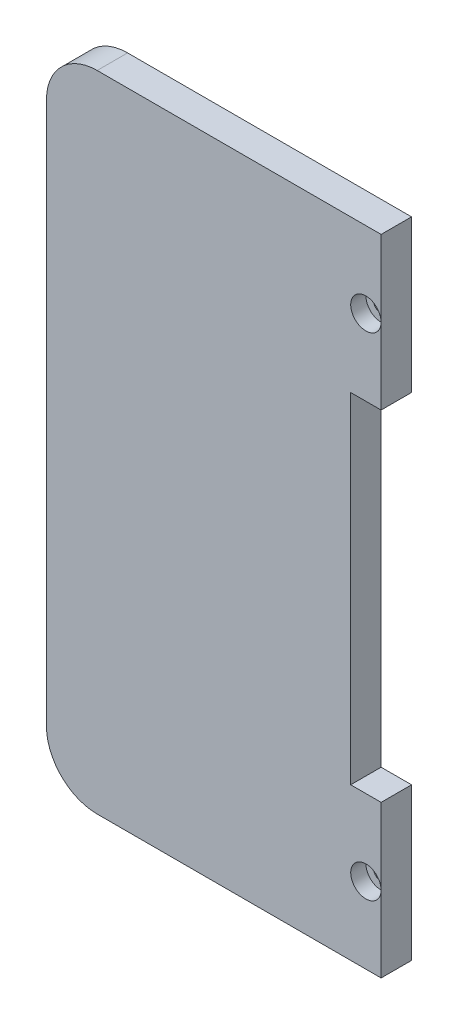
ISO-10303-21;
HEADER;
FILE_DESCRIPTION(('STEP AP214'),'2;1');
FILE_NAME('part.step','',(''),(''),'','','');
FILE_SCHEMA(('AUTOMOTIVE_DESIGN { 1 0 10303 214 1 1 1 1 }'));
ENDSEC;
DATA;
#1=APPLICATION_CONTEXT('core data for automotive mechanical design processes');
#2=APPLICATION_PROTOCOL_DEFINITION('international standard','automotive_design',2000,#1);
#3=PRODUCT_CONTEXT('',#1,'mechanical');
#4=PRODUCT('Part','Part','',(#3));
#5=PRODUCT_RELATED_PRODUCT_CATEGORY('part','',(#4));
#6=PRODUCT_DEFINITION_FORMATION('','',#4);
#7=PRODUCT_DEFINITION_CONTEXT('part definition',#1,'design');
#8=PRODUCT_DEFINITION('design','',#6,#7);
#9=PRODUCT_DEFINITION_SHAPE('','',#8);
#10=(LENGTH_UNIT() NAMED_UNIT(*) SI_UNIT(.MILLI.,.METRE.));
#11=(NAMED_UNIT(*) PLANE_ANGLE_UNIT() SI_UNIT($,.RADIAN.));
#12=(NAMED_UNIT(*) SI_UNIT($,.STERADIAN.) SOLID_ANGLE_UNIT());
#13=UNCERTAINTY_MEASURE_WITH_UNIT(LENGTH_MEASURE(1.E-05),#10,'distance_accuracy_value','');
#14=(GEOMETRIC_REPRESENTATION_CONTEXT(3) GLOBAL_UNCERTAINTY_ASSIGNED_CONTEXT((#13)) GLOBAL_UNIT_ASSIGNED_CONTEXT((#10,
#11,#12)) REPRESENTATION_CONTEXT('',''));
#15=CARTESIAN_POINT('',(0.,0.,0.));
#16=DIRECTION('',(0.,0.,1.));
#17=DIRECTION('',(1.,0.,0.));
#18=AXIS2_PLACEMENT_3D('',#15,#16,#17);
#19=CARTESIAN_POINT('',(30.,-48.5,6.));
#20=DIRECTION('',(0.,0.,-1.));
#21=DIRECTION('',(-1.,0.,0.));
#22=AXIS2_PLACEMENT_3D('',#19,#20,#21);
#23=CYLINDRICAL_SURFACE('',#22,1.5);
#24=CARTESIAN_POINT('',(30.,-48.5,0.));
#25=DIRECTION('',(0.,0.,-1.));
#26=DIRECTION('',(-1.,0.,0.));
#27=AXIS2_PLACEMENT_3D('',#24,#25,#26);
#28=CIRCLE('',#27,1.5);
#29=CARTESIAN_POINT('',(28.5,-48.5,0.));
#30=VERTEX_POINT('',#29);
#31=EDGE_CURVE('E179',#30,#30,#28,.T.);
#32=ORIENTED_EDGE('',*,*,#31,.T.);
#33=EDGE_LOOP('',(#32));
#34=FACE_BOUND('',#33,.T.);
#35=CARTESIAN_POINT('',(30.,-48.5,3.));
#36=DIRECTION('',(0.,0.,1.));
#37=DIRECTION('',(1.,0.,0.));
#38=AXIS2_PLACEMENT_3D('',#35,#36,#37);
#39=CIRCLE('',#38,1.5);
#40=CARTESIAN_POINT('',(31.5,-48.5,3.));
#41=VERTEX_POINT('',#40);
#42=EDGE_CURVE('E37',#41,#41,#39,.F.);
#43=ORIENTED_EDGE('',*,*,#42,.F.);
#44=EDGE_LOOP('',(#43));
#45=FACE_BOUND('',#44,.T.);
#46=ADVANCED_FACE('F33',(#34,#45),#23,.F.);
#47=CARTESIAN_POINT('',(30.,48.5,6.));
#48=DIRECTION('',(0.,0.,-1.));
#49=DIRECTION('',(-1.,0.,0.));
#50=AXIS2_PLACEMENT_3D('',#47,#48,#49);
#51=CYLINDRICAL_SURFACE('',#50,1.5);
#52=CARTESIAN_POINT('',(30.,48.5,0.));
#53=DIRECTION('',(0.,0.,-1.));
#54=DIRECTION('',(1.,0.,0.));
#55=AXIS2_PLACEMENT_3D('',#52,#53,#54);
#56=CIRCLE('',#55,1.5);
#57=CARTESIAN_POINT('',(31.5,48.5,0.));
#58=VERTEX_POINT('',#57);
#59=EDGE_CURVE('E174',#58,#58,#56,.T.);
#60=ORIENTED_EDGE('',*,*,#59,.T.);
#61=EDGE_LOOP('',(#60));
#62=FACE_BOUND('',#61,.T.);
#63=CARTESIAN_POINT('',(30.,48.5,3.));
#64=DIRECTION('',(0.,0.,1.));
#65=DIRECTION('',(1.,0.,0.));
#66=AXIS2_PLACEMENT_3D('',#63,#64,#65);
#67=CIRCLE('',#66,1.5);
#68=CARTESIAN_POINT('',(31.5,48.5,3.));
#69=VERTEX_POINT('',#68);
#70=EDGE_CURVE('E172',#69,#69,#67,.F.);
#71=ORIENTED_EDGE('',*,*,#70,.F.);
#72=EDGE_LOOP('',(#71));
#73=FACE_BOUND('',#72,.T.);
#74=ADVANCED_FACE('F250',(#62,#73),#51,.F.);
#75=CARTESIAN_POINT('',(33.,63.5,6.));
#76=DIRECTION('',(-1.,0.,0.));
#77=DIRECTION('',(0.,-1.,0.));
#78=AXIS2_PLACEMENT_3D('',#75,#76,#77);
#79=PLANE('',#78);
#80=DIRECTION('',(0.,1.,0.));
#81=VECTOR('',#80,1.);
#82=CARTESIAN_POINT('',(33.,63.5,6.));
#83=LINE('',#82,#81);
#84=CARTESIAN_POINT('',(33.,33.5,6.));
#85=VERTEX_POINT('',#84);
#86=CARTESIAN_POINT('',(33.,63.5,6.));
#87=VERTEX_POINT('',#86);
#88=EDGE_CURVE('E136',#85,#87,#83,.T.);
#89=ORIENTED_EDGE('',*,*,#88,.F.);
#90=DIRECTION('',(0.,0.,-1.));
#91=VECTOR('',#90,1.);
#92=CARTESIAN_POINT('',(33.,33.5,6.));
#93=LINE('',#92,#91);
#94=CARTESIAN_POINT('',(33.,33.5,0.));
#95=VERTEX_POINT('',#94);
#96=EDGE_CURVE('E202',#85,#95,#93,.T.);
#97=ORIENTED_EDGE('',*,*,#96,.T.);
#98=DIRECTION('',(0.,1.,0.));
#99=VECTOR('',#98,1.);
#100=CARTESIAN_POINT('',(33.,63.5,0.));
#101=LINE('',#100,#99);
#102=CARTESIAN_POINT('',(33.,63.5,0.));
#103=VERTEX_POINT('',#102);
#104=EDGE_CURVE('E149',#95,#103,#101,.T.);
#105=ORIENTED_EDGE('',*,*,#104,.T.);
#106=DIRECTION('',(0.,0.,-1.));
#107=VECTOR('',#106,1.);
#108=CARTESIAN_POINT('',(33.,63.5,6.));
#109=LINE('',#108,#107);
#110=EDGE_CURVE('E157',#87,#103,#109,.T.);
#111=ORIENTED_EDGE('',*,*,#110,.F.);
#112=EDGE_LOOP('',(#89,#97,#105,#111));
#113=FACE_BOUND('',#112,.T.);
#114=ADVANCED_FACE('F219',(#113),#79,.F.);
#115=CARTESIAN_POINT('',(33.,-63.5,0.));
#116=VERTEX_POINT('',#115);
#117=CARTESIAN_POINT('',(33.,-33.5,0.));
#118=VERTEX_POINT('',#117);
#119=EDGE_CURVE('E128',#116,#118,#101,.T.);
#120=ORIENTED_EDGE('',*,*,#119,.T.);
#121=DIRECTION('',(0.,0.,-1.));
#122=VECTOR('',#121,1.);
#123=CARTESIAN_POINT('',(33.,-33.5,6.));
#124=LINE('',#123,#122);
#125=CARTESIAN_POINT('',(33.,-33.5,6.));
#126=VERTEX_POINT('',#125);
#127=EDGE_CURVE('E50',#126,#118,#124,.T.);
#128=ORIENTED_EDGE('',*,*,#127,.F.);
#129=CARTESIAN_POINT('',(33.,-63.5,6.));
#130=VERTEX_POINT('',#129);
#131=EDGE_CURVE('E126',#130,#126,#83,.T.);
#132=ORIENTED_EDGE('',*,*,#131,.F.);
#133=DIRECTION('',(0.,0.,-1.));
#134=VECTOR('',#133,1.);
#135=CARTESIAN_POINT('',(33.,-63.5,6.));
#136=LINE('',#135,#134);
#137=EDGE_CURVE('E146',#130,#116,#136,.T.);
#138=ORIENTED_EDGE('',*,*,#137,.T.);
#139=EDGE_LOOP('',(#120,#128,#132,#138));
#140=FACE_BOUND('',#139,.T.);
#141=ADVANCED_FACE('F124',(#140),#79,.F.);
#142=CARTESIAN_POINT('',(-33.,63.5,6.));
#143=DIRECTION('',(0.,-1.,0.));
#144=DIRECTION('',(0.,0.,-1.));
#145=AXIS2_PLACEMENT_3D('',#142,#143,#144);
#146=PLANE('',#145);
#147=DIRECTION('',(-1.,0.,0.));
#148=VECTOR('',#147,1.);
#149=CARTESIAN_POINT('',(-33.,63.5,0.));
#150=LINE('',#149,#148);
#151=CARTESIAN_POINT('',(-23.,63.5,0.));
#152=VERTEX_POINT('',#151);
#153=EDGE_CURVE('E148',#103,#152,#150,.T.);
#154=ORIENTED_EDGE('',*,*,#153,.T.);
#155=DIRECTION('',(0.,0.,-1.));
#156=VECTOR('',#155,1.);
#157=CARTESIAN_POINT('',(-23.,63.5,6.));
#158=LINE('',#157,#156);
#159=CARTESIAN_POINT('',(-23.,63.5,6.));
#160=VERTEX_POINT('',#159);
#161=EDGE_CURVE('E169',#152,#160,#158,.F.);
#162=ORIENTED_EDGE('',*,*,#161,.T.);
#163=DIRECTION('',(-1.,0.,0.));
#164=VECTOR('',#163,1.);
#165=CARTESIAN_POINT('',(-33.,63.5,6.));
#166=LINE('',#165,#164);
#167=EDGE_CURVE('E135',#87,#160,#166,.T.);
#168=ORIENTED_EDGE('',*,*,#167,.F.);
#169=ORIENTED_EDGE('',*,*,#110,.T.);
#170=EDGE_LOOP('',(#154,#162,#168,#169));
#171=FACE_BOUND('',#170,.T.);
#172=ADVANCED_FACE('F224',(#171),#146,.F.);
#173=CARTESIAN_POINT('',(-33.,63.5,6.));
#174=DIRECTION('',(1.,0.,0.));
#175=DIRECTION('',(0.,1.,0.));
#176=AXIS2_PLACEMENT_3D('',#173,#174,#175);
#177=PLANE('',#176);
#178=DIRECTION('',(0.,-1.,0.));
#179=VECTOR('',#178,1.);
#180=CARTESIAN_POINT('',(-33.,63.5,6.));
#181=LINE('',#180,#179);
#182=CARTESIAN_POINT('',(-33.,53.5,6.));
#183=VERTEX_POINT('',#182);
#184=CARTESIAN_POINT('',(-33.,-53.5,6.));
#185=VERTEX_POINT('',#184);
#186=EDGE_CURVE('E139',#183,#185,#181,.T.);
#187=ORIENTED_EDGE('',*,*,#186,.F.);
#188=DIRECTION('',(0.,0.,-1.));
#189=VECTOR('',#188,1.);
#190=CARTESIAN_POINT('',(-33.,53.5,6.));
#191=LINE('',#190,#189);
#192=CARTESIAN_POINT('',(-33.,53.5,0.));
#193=VERTEX_POINT('',#192);
#194=EDGE_CURVE('E162',#183,#193,#191,.T.);
#195=ORIENTED_EDGE('',*,*,#194,.T.);
#196=DIRECTION('',(0.,-1.,0.));
#197=VECTOR('',#196,1.);
#198=CARTESIAN_POINT('',(-33.,63.5,0.));
#199=LINE('',#198,#197);
#200=CARTESIAN_POINT('',(-33.,-53.5,0.));
#201=VERTEX_POINT('',#200);
#202=EDGE_CURVE('E152',#193,#201,#199,.T.);
#203=ORIENTED_EDGE('',*,*,#202,.T.);
#204=DIRECTION('',(0.,0.,-1.));
#205=VECTOR('',#204,1.);
#206=CARTESIAN_POINT('',(-33.,-53.5,6.));
#207=LINE('',#206,#205);
#208=EDGE_CURVE('E160',#201,#185,#207,.F.);
#209=ORIENTED_EDGE('',*,*,#208,.T.);
#210=EDGE_LOOP('',(#187,#195,#203,#209));
#211=FACE_BOUND('',#210,.T.);
#212=ADVANCED_FACE('F231',(#211),#177,.F.);
#213=CARTESIAN_POINT('',(-33.,-63.5,6.));
#214=DIRECTION('',(0.,1.,0.));
#215=DIRECTION('',(0.,0.,1.));
#216=AXIS2_PLACEMENT_3D('',#213,#214,#215);
#217=PLANE('',#216);
#218=DIRECTION('',(1.,0.,0.));
#219=VECTOR('',#218,1.);
#220=CARTESIAN_POINT('',(-33.,-63.5,6.));
#221=LINE('',#220,#219);
#222=CARTESIAN_POINT('',(-23.,-63.5,6.));
#223=VERTEX_POINT('',#222);
#224=EDGE_CURVE('E133',#223,#130,#221,.T.);
#225=ORIENTED_EDGE('',*,*,#224,.F.);
#226=DIRECTION('',(0.,0.,-1.));
#227=VECTOR('',#226,1.);
#228=CARTESIAN_POINT('',(-23.,-63.5,6.));
#229=LINE('',#228,#227);
#230=CARTESIAN_POINT('',(-23.,-63.5,0.));
#231=VERTEX_POINT('',#230);
#232=EDGE_CURVE('E11',#223,#231,#229,.T.);
#233=ORIENTED_EDGE('',*,*,#232,.T.);
#234=DIRECTION('',(1.,0.,0.));
#235=VECTOR('',#234,1.);
#236=CARTESIAN_POINT('',(-33.,-63.5,0.));
#237=LINE('',#236,#235);
#238=EDGE_CURVE('E141',#231,#116,#237,.T.);
#239=ORIENTED_EDGE('',*,*,#238,.T.);
#240=ORIENTED_EDGE('',*,*,#137,.F.);
#241=EDGE_LOOP('',(#225,#233,#239,#240));
#242=FACE_BOUND('',#241,.T.);
#243=ADVANCED_FACE('F238',(#242),#217,.F.);
#244=CARTESIAN_POINT('',(0.,0.,6.));
#245=DIRECTION('',(0.,0.,1.));
#246=DIRECTION('',(1.,0.,0.));
#247=AXIS2_PLACEMENT_3D('',#244,#245,#246);
#248=PLANE('',#247);
#249=CARTESIAN_POINT('',(30.,-48.5,6.));
#250=DIRECTION('',(0.,0.,1.));
#251=DIRECTION('',(1.,0.,0.));
#252=AXIS2_PLACEMENT_3D('',#249,#250,#251);
#253=CIRCLE('',#252,2.995);
#254=CARTESIAN_POINT('',(32.995,-48.5,6.));
#255=VERTEX_POINT('',#254);
#256=EDGE_CURVE('E189',#255,#255,#253,.T.);
#257=ORIENTED_EDGE('',*,*,#256,.F.);
#258=EDGE_LOOP('',(#257));
#259=FACE_BOUND('',#258,.T.);
#260=CARTESIAN_POINT('',(30.,48.5,6.));
#261=DIRECTION('',(0.,0.,1.));
#262=DIRECTION('',(1.,0.,0.));
#263=AXIS2_PLACEMENT_3D('',#260,#261,#262);
#264=CIRCLE('',#263,2.995);
#265=CARTESIAN_POINT('',(32.995,48.5,6.));
#266=VERTEX_POINT('',#265);
#267=EDGE_CURVE('E182',#266,#266,#264,.T.);
#268=ORIENTED_EDGE('',*,*,#267,.F.);
#269=EDGE_LOOP('',(#268));
#270=FACE_BOUND('',#269,.T.);
#271=DIRECTION('',(1.,0.,0.));
#272=VECTOR('',#271,1.);
#273=CARTESIAN_POINT('',(27.,33.5,6.));
#274=LINE('',#273,#272);
#275=CARTESIAN_POINT('',(27.,33.5,6.));
#276=VERTEX_POINT('',#275);
#277=EDGE_CURVE('E129',#276,#85,#274,.T.);
#278=ORIENTED_EDGE('',*,*,#277,.T.);
#279=ORIENTED_EDGE('',*,*,#88,.T.);
#280=ORIENTED_EDGE('',*,*,#167,.T.);
#281=CARTESIAN_POINT('',(-23.,53.5,6.));
#282=DIRECTION('',(0.,0.,1.));
#283=DIRECTION('',(1.,0.,0.));
#284=AXIS2_PLACEMENT_3D('',#281,#282,#283);
#285=CIRCLE('',#284,10.);
#286=EDGE_CURVE('E42',#160,#183,#285,.T.);
#287=ORIENTED_EDGE('',*,*,#286,.T.);
#288=ORIENTED_EDGE('',*,*,#186,.T.);
#289=CARTESIAN_POINT('',(-23.,-53.5,6.));
#290=DIRECTION('',(0.,0.,1.));
#291=DIRECTION('',(1.,0.,0.));
#292=AXIS2_PLACEMENT_3D('',#289,#290,#291);
#293=CIRCLE('',#292,10.);
#294=EDGE_CURVE('E58',#185,#223,#293,.T.);
#295=ORIENTED_EDGE('',*,*,#294,.T.);
#296=ORIENTED_EDGE('',*,*,#224,.T.);
#297=ORIENTED_EDGE('',*,*,#131,.T.);
#298=DIRECTION('',(-1.,0.,0.));
#299=VECTOR('',#298,1.);
#300=CARTESIAN_POINT('',(27.,-33.5,6.));
#301=LINE('',#300,#299);
#302=CARTESIAN_POINT('',(27.,-33.5,6.));
#303=VERTEX_POINT('',#302);
#304=EDGE_CURVE('E112',#126,#303,#301,.T.);
#305=ORIENTED_EDGE('',*,*,#304,.T.);
#306=DIRECTION('',(0.,1.,0.));
#307=VECTOR('',#306,1.);
#308=CARTESIAN_POINT('',(27.,-33.5,6.));
#309=LINE('',#308,#307);
#310=EDGE_CURVE('E118',#303,#276,#309,.T.);
#311=ORIENTED_EDGE('',*,*,#310,.T.);
#312=EDGE_LOOP('',(#278,#279,#280,#287,#288,#295,#296,#297,#305,#311));
#313=FACE_BOUND('',#312,.T.);
#314=ADVANCED_FACE('F132',(#259,#270,#313),#248,.T.);
#315=CARTESIAN_POINT('',(0.,0.,0.));
#316=DIRECTION('',(0.,0.,1.));
#317=DIRECTION('',(1.,0.,0.));
#318=AXIS2_PLACEMENT_3D('',#315,#316,#317);
#319=PLANE('',#318);
#320=ORIENTED_EDGE('',*,*,#59,.F.);
#321=EDGE_LOOP('',(#320));
#322=FACE_BOUND('',#321,.T.);
#323=ORIENTED_EDGE('',*,*,#31,.F.);
#324=EDGE_LOOP('',(#323));
#325=FACE_BOUND('',#324,.T.);
#326=ORIENTED_EDGE('',*,*,#104,.F.);
#327=DIRECTION('',(1.,0.,0.));
#328=VECTOR('',#327,1.);
#329=CARTESIAN_POINT('',(27.,33.5,0.));
#330=LINE('',#329,#328);
#331=CARTESIAN_POINT('',(27.,33.5,0.));
#332=VERTEX_POINT('',#331);
#333=EDGE_CURVE('E119',#332,#95,#330,.T.);
#334=ORIENTED_EDGE('',*,*,#333,.F.);
#335=DIRECTION('',(0.,1.,0.));
#336=VECTOR('',#335,1.);
#337=CARTESIAN_POINT('',(27.,-33.5,0.));
#338=LINE('',#337,#336);
#339=CARTESIAN_POINT('',(27.,-33.5,0.));
#340=VERTEX_POINT('',#339);
#341=EDGE_CURVE('E198',#340,#332,#338,.T.);
#342=ORIENTED_EDGE('',*,*,#341,.F.);
#343=DIRECTION('',(-1.,0.,0.));
#344=VECTOR('',#343,1.);
#345=CARTESIAN_POINT('',(27.,-33.5,0.));
#346=LINE('',#345,#344);
#347=EDGE_CURVE('E193',#118,#340,#346,.T.);
#348=ORIENTED_EDGE('',*,*,#347,.F.);
#349=ORIENTED_EDGE('',*,*,#119,.F.);
#350=ORIENTED_EDGE('',*,*,#238,.F.);
#351=CARTESIAN_POINT('',(-23.,-53.5,0.));
#352=DIRECTION('',(0.,0.,1.));
#353=DIRECTION('',(1.,0.,0.));
#354=AXIS2_PLACEMENT_3D('',#351,#352,#353);
#355=CIRCLE('',#354,10.);
#356=EDGE_CURVE('E165',#231,#201,#355,.F.);
#357=ORIENTED_EDGE('',*,*,#356,.T.);
#358=ORIENTED_EDGE('',*,*,#202,.F.);
#359=CARTESIAN_POINT('',(-23.,53.5,0.));
#360=DIRECTION('',(0.,0.,1.));
#361=DIRECTION('',(1.,0.,0.));
#362=AXIS2_PLACEMENT_3D('',#359,#360,#361);
#363=CIRCLE('',#362,10.);
#364=EDGE_CURVE('E167',#193,#152,#363,.F.);
#365=ORIENTED_EDGE('',*,*,#364,.T.);
#366=ORIENTED_EDGE('',*,*,#153,.F.);
#367=EDGE_LOOP('',(#326,#334,#342,#348,#349,#350,#357,#358,#365,#366));
#368=FACE_BOUND('',#367,.T.);
#369=ADVANCED_FACE('F212',(#322,#325,#368),#319,.F.);
#370=CARTESIAN_POINT('',(-23.,53.5,6.));
#371=DIRECTION('',(0.,0.,-1.));
#372=DIRECTION('',(-1.,0.,0.));
#373=AXIS2_PLACEMENT_3D('',#370,#371,#372);
#374=CYLINDRICAL_SURFACE('',#373,10.);
#375=ORIENTED_EDGE('',*,*,#286,.F.);
#376=ORIENTED_EDGE('',*,*,#161,.F.);
#377=ORIENTED_EDGE('',*,*,#364,.F.);
#378=ORIENTED_EDGE('',*,*,#194,.F.);
#379=EDGE_LOOP('',(#375,#376,#377,#378));
#380=FACE_BOUND('',#379,.T.);
#381=ADVANCED_FACE('F227',(#380),#374,.T.);
#382=CARTESIAN_POINT('',(-23.,-53.5,6.));
#383=DIRECTION('',(0.,0.,-1.));
#384=DIRECTION('',(-1.,0.,0.));
#385=AXIS2_PLACEMENT_3D('',#382,#383,#384);
#386=CYLINDRICAL_SURFACE('',#385,10.);
#387=ORIENTED_EDGE('',*,*,#294,.F.);
#388=ORIENTED_EDGE('',*,*,#208,.F.);
#389=ORIENTED_EDGE('',*,*,#356,.F.);
#390=ORIENTED_EDGE('',*,*,#232,.F.);
#391=EDGE_LOOP('',(#387,#388,#389,#390));
#392=FACE_BOUND('',#391,.T.);
#393=ADVANCED_FACE('F35',(#392),#386,.T.);
#394=CARTESIAN_POINT('',(27.,33.5,6.));
#395=DIRECTION('',(0.,1.,0.));
#396=DIRECTION('',(0.,0.,1.));
#397=AXIS2_PLACEMENT_3D('',#394,#395,#396);
#398=PLANE('',#397);
#399=ORIENTED_EDGE('',*,*,#333,.T.);
#400=ORIENTED_EDGE('',*,*,#96,.F.);
#401=ORIENTED_EDGE('',*,*,#277,.F.);
#402=DIRECTION('',(0.,0.,-1.));
#403=VECTOR('',#402,1.);
#404=CARTESIAN_POINT('',(27.,33.5,6.));
#405=LINE('',#404,#403);
#406=EDGE_CURVE('E205',#276,#332,#405,.T.);
#407=ORIENTED_EDGE('',*,*,#406,.T.);
#408=EDGE_LOOP('',(#399,#400,#401,#407));
#409=FACE_BOUND('',#408,.T.);
#410=ADVANCED_FACE('F215',(#409),#398,.F.);
#411=CARTESIAN_POINT('',(27.,-33.5,6.));
#412=DIRECTION('',(-1.,0.,0.));
#413=DIRECTION('',(0.,0.,1.));
#414=AXIS2_PLACEMENT_3D('',#411,#412,#413);
#415=PLANE('',#414);
#416=ORIENTED_EDGE('',*,*,#341,.T.);
#417=ORIENTED_EDGE('',*,*,#406,.F.);
#418=ORIENTED_EDGE('',*,*,#310,.F.);
#419=DIRECTION('',(0.,0.,-1.));
#420=VECTOR('',#419,1.);
#421=CARTESIAN_POINT('',(27.,-33.5,6.));
#422=LINE('',#421,#420);
#423=EDGE_CURVE('E114',#303,#340,#422,.T.);
#424=ORIENTED_EDGE('',*,*,#423,.T.);
#425=EDGE_LOOP('',(#416,#417,#418,#424));
#426=FACE_BOUND('',#425,.T.);
#427=ADVANCED_FACE('F207',(#426),#415,.F.);
#428=CARTESIAN_POINT('',(27.,-33.5,6.));
#429=DIRECTION('',(0.,-1.,0.));
#430=DIRECTION('',(0.,0.,-1.));
#431=AXIS2_PLACEMENT_3D('',#428,#429,#430);
#432=PLANE('',#431);
#433=ORIENTED_EDGE('',*,*,#347,.T.);
#434=ORIENTED_EDGE('',*,*,#423,.F.);
#435=ORIENTED_EDGE('',*,*,#304,.F.);
#436=ORIENTED_EDGE('',*,*,#127,.T.);
#437=EDGE_LOOP('',(#433,#434,#435,#436));
#438=FACE_BOUND('',#437,.T.);
#439=ADVANCED_FACE('F113',(#438),#432,.F.);
#440=CARTESIAN_POINT('',(30.,48.5,3.));
#441=DIRECTION('',(0.,0.,1.));
#442=DIRECTION('',(1.,0.,0.));
#443=AXIS2_PLACEMENT_3D('',#440,#441,#442);
#444=PLANE('',#443);
#445=CARTESIAN_POINT('',(30.,48.5,3.));
#446=DIRECTION('',(0.,0.,1.));
#447=DIRECTION('',(1.,0.,0.));
#448=AXIS2_PLACEMENT_3D('',#445,#446,#447);
#449=CIRCLE('',#448,2.995);
#450=CARTESIAN_POINT('',(32.995,48.5,3.));
#451=VERTEX_POINT('',#450);
#452=EDGE_CURVE('E175',#451,#451,#449,.T.);
#453=ORIENTED_EDGE('',*,*,#452,.T.);
#454=EDGE_LOOP('',(#453));
#455=FACE_BOUND('',#454,.T.);
#456=ORIENTED_EDGE('',*,*,#70,.T.);
#457=EDGE_LOOP('',(#456));
#458=FACE_BOUND('',#457,.T.);
#459=ADVANCED_FACE('F266',(#455,#458),#444,.T.);
#460=CARTESIAN_POINT('',(30.,48.5,3.));
#461=DIRECTION('',(0.,0.,1.));
#462=DIRECTION('',(1.,0.,0.));
#463=AXIS2_PLACEMENT_3D('',#460,#461,#462);
#464=CYLINDRICAL_SURFACE('',#463,2.995);
#465=ORIENTED_EDGE('',*,*,#452,.F.);
#466=EDGE_LOOP('',(#465));
#467=FACE_BOUND('',#466,.T.);
#468=ORIENTED_EDGE('',*,*,#267,.T.);
#469=EDGE_LOOP('',(#468));
#470=FACE_BOUND('',#469,.T.);
#471=ADVANCED_FACE('F363',(#467,#470),#464,.F.);
#472=CARTESIAN_POINT('',(30.,-48.5,3.));
#473=DIRECTION('',(0.,0.,1.));
#474=DIRECTION('',(1.,0.,0.));
#475=AXIS2_PLACEMENT_3D('',#472,#473,#474);
#476=PLANE('',#475);
#477=CARTESIAN_POINT('',(30.,-48.5,3.));
#478=DIRECTION('',(0.,0.,1.));
#479=DIRECTION('',(1.,0.,0.));
#480=AXIS2_PLACEMENT_3D('',#477,#478,#479);
#481=CIRCLE('',#480,2.995);
#482=CARTESIAN_POINT('',(32.995,-48.5,3.));
#483=VERTEX_POINT('',#482);
#484=EDGE_CURVE('E398',#483,#483,#481,.T.);
#485=ORIENTED_EDGE('',*,*,#484,.T.);
#486=EDGE_LOOP('',(#485));
#487=FACE_BOUND('',#486,.T.);
#488=ORIENTED_EDGE('',*,*,#42,.T.);
#489=EDGE_LOOP('',(#488));
#490=FACE_BOUND('',#489,.T.);
#491=ADVANCED_FACE('F372',(#487,#490),#476,.T.);
#492=CARTESIAN_POINT('',(30.,-48.5,3.));
#493=DIRECTION('',(0.,0.,1.));
#494=DIRECTION('',(1.,0.,0.));
#495=AXIS2_PLACEMENT_3D('',#492,#493,#494);
#496=CYLINDRICAL_SURFACE('',#495,2.995);
#497=ORIENTED_EDGE('',*,*,#484,.F.);
#498=EDGE_LOOP('',(#497));
#499=FACE_BOUND('',#498,.T.);
#500=ORIENTED_EDGE('',*,*,#256,.T.);
#501=EDGE_LOOP('',(#500));
#502=FACE_BOUND('',#501,.T.);
#503=ADVANCED_FACE('F381',(#499,#502),#496,.F.);
#504=CLOSED_SHELL('',(#46,#74,#114,#141,#172,#212,#243,#314,#369,#381,#393,#410,#427,#439,#459,
#471,#491,#503));
#505=MANIFOLD_SOLID_BREP('B2',#504);
#506=ADVANCED_BREP_SHAPE_REPRESENTATION('',(#18,#505),#14);
#507=SHAPE_DEFINITION_REPRESENTATION(#9,#506);
ENDSEC;
END-ISO-10303-21;
